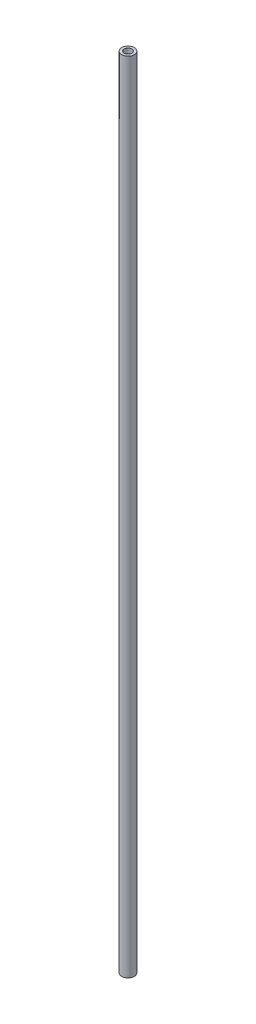
ISO-10303-21;
HEADER;
FILE_DESCRIPTION(('STEP AP214'),'2;1');
FILE_NAME('part.step','',(''),(''),'','','');
FILE_SCHEMA(('AUTOMOTIVE_DESIGN { 1 0 10303 214 1 1 1 1 }'));
ENDSEC;
DATA;
#1=APPLICATION_CONTEXT('core data for automotive mechanical design processes');
#2=APPLICATION_PROTOCOL_DEFINITION('international standard','automotive_design',2000,#1);
#3=PRODUCT_CONTEXT('',#1,'mechanical');
#4=PRODUCT('Part','Part','',(#3));
#5=PRODUCT_RELATED_PRODUCT_CATEGORY('part','',(#4));
#6=PRODUCT_DEFINITION_FORMATION('','',#4);
#7=PRODUCT_DEFINITION_CONTEXT('part definition',#1,'design');
#8=PRODUCT_DEFINITION('design','',#6,#7);
#9=PRODUCT_DEFINITION_SHAPE('','',#8);
#10=(LENGTH_UNIT() NAMED_UNIT(*) SI_UNIT(.MILLI.,.METRE.));
#11=(NAMED_UNIT(*) PLANE_ANGLE_UNIT() SI_UNIT($,.RADIAN.));
#12=(NAMED_UNIT(*) SI_UNIT($,.STERADIAN.) SOLID_ANGLE_UNIT());
#13=UNCERTAINTY_MEASURE_WITH_UNIT(LENGTH_MEASURE(1.E-05),#10,'distance_accuracy_value','');
#14=(GEOMETRIC_REPRESENTATION_CONTEXT(3) GLOBAL_UNCERTAINTY_ASSIGNED_CONTEXT((#13)) GLOBAL_UNIT_ASSIGNED_CONTEXT((#10,
#11,#12)) REPRESENTATION_CONTEXT('',''));
#15=CARTESIAN_POINT('',(0.,0.,0.));
#16=DIRECTION('',(0.,0.,1.));
#17=DIRECTION('',(1.,0.,0.));
#18=AXIS2_PLACEMENT_3D('',#15,#16,#17);
#19=CARTESIAN_POINT('',(0.,318.399999978,0.));
#20=DIRECTION('',(0.,1.,0.));
#21=DIRECTION('',(0.,0.,1.));
#22=AXIS2_PLACEMENT_3D('',#19,#20,#21);
#23=PLANE('',#22);
#24=CARTESIAN_POINT('',(0.,318.399999978,0.));
#25=DIRECTION('',(0.,1.,0.));
#26=DIRECTION('',(0.,0.,1.));
#27=AXIS2_PLACEMENT_3D('',#24,#25,#26);
#28=CIRCLE('',#27,2.5);
#29=CARTESIAN_POINT('',(0.,318.399999978,2.5));
#30=VERTEX_POINT('',#29);
#31=EDGE_CURVE('E10',#30,#30,#28,.T.);
#32=ORIENTED_EDGE('',*,*,#31,.T.);
#33=EDGE_LOOP('',(#32));
#34=FACE_BOUND('',#33,.T.);
#35=CARTESIAN_POINT('',(0.,318.399999978,0.));
#36=DIRECTION('',(0.,1.,0.));
#37=DIRECTION('',(0.,0.,1.));
#38=AXIS2_PLACEMENT_3D('',#35,#36,#37);
#39=CIRCLE('',#38,1.5);
#40=CARTESIAN_POINT('',(0.,318.399999978,1.5));
#41=VERTEX_POINT('',#40);
#42=EDGE_CURVE('E50',#41,#41,#39,.T.);
#43=ORIENTED_EDGE('',*,*,#42,.F.);
#44=EDGE_LOOP('',(#43));
#45=FACE_BOUND('',#44,.T.);
#46=ADVANCED_FACE('F39',(#34,#45),#23,.T.);
#47=CARTESIAN_POINT('',(0.,0.,0.));
#48=DIRECTION('',(0.,1.,0.));
#49=DIRECTION('',(0.,0.,1.));
#50=AXIS2_PLACEMENT_3D('',#47,#48,#49);
#51=PLANE('',#50);
#52=CARTESIAN_POINT('',(0.,0.,0.));
#53=DIRECTION('',(0.,1.,0.));
#54=DIRECTION('',(0.,0.,1.));
#55=AXIS2_PLACEMENT_3D('',#52,#53,#54);
#56=CIRCLE('',#55,2.5);
#57=CARTESIAN_POINT('',(0.,0.,2.5));
#58=VERTEX_POINT('',#57);
#59=EDGE_CURVE('E43',#58,#58,#56,.T.);
#60=ORIENTED_EDGE('',*,*,#59,.F.);
#61=EDGE_LOOP('',(#60));
#62=FACE_BOUND('',#61,.T.);
#63=CARTESIAN_POINT('',(0.,0.,0.));
#64=DIRECTION('',(0.,1.,0.));
#65=DIRECTION('',(0.,0.,1.));
#66=AXIS2_PLACEMENT_3D('',#63,#64,#65);
#67=CIRCLE('',#66,1.5);
#68=CARTESIAN_POINT('',(0.,0.,1.5));
#69=VERTEX_POINT('',#68);
#70=EDGE_CURVE('E52',#69,#69,#67,.T.);
#71=ORIENTED_EDGE('',*,*,#70,.T.);
#72=EDGE_LOOP('',(#71));
#73=FACE_BOUND('',#72,.T.);
#74=ADVANCED_FACE('F62',(#62,#73),#51,.F.);
#75=CARTESIAN_POINT('',(0.,318.399999978,0.));
#76=DIRECTION('',(0.,-1.,0.));
#77=DIRECTION('',(0.,0.,-1.));
#78=AXIS2_PLACEMENT_3D('',#75,#76,#77);
#79=CYLINDRICAL_SURFACE('',#78,2.5);
#80=ORIENTED_EDGE('',*,*,#31,.F.);
#81=EDGE_LOOP('',(#80));
#82=FACE_BOUND('',#81,.T.);
#83=ORIENTED_EDGE('',*,*,#59,.T.);
#84=EDGE_LOOP('',(#83));
#85=FACE_BOUND('',#84,.T.);
#86=ADVANCED_FACE('F41',(#82,#85),#79,.T.);
#87=CARTESIAN_POINT('',(0.,318.399999978,0.));
#88=DIRECTION('',(0.,-1.,0.));
#89=DIRECTION('',(0.,0.,-1.));
#90=AXIS2_PLACEMENT_3D('',#87,#88,#89);
#91=CYLINDRICAL_SURFACE('',#90,1.5);
#92=ORIENTED_EDGE('',*,*,#42,.T.);
#93=EDGE_LOOP('',(#92));
#94=FACE_BOUND('',#93,.T.);
#95=ORIENTED_EDGE('',*,*,#70,.F.);
#96=EDGE_LOOP('',(#95));
#97=FACE_BOUND('',#96,.T.);
#98=ADVANCED_FACE('F58',(#94,#97),#91,.F.);
#99=CLOSED_SHELL('',(#46,#74,#86,#98));
#100=MANIFOLD_SOLID_BREP('B2',#99);
#101=ADVANCED_BREP_SHAPE_REPRESENTATION('',(#18,#100),#14);
#102=SHAPE_DEFINITION_REPRESENTATION(#9,#101);
ENDSEC;
END-ISO-10303-21;
